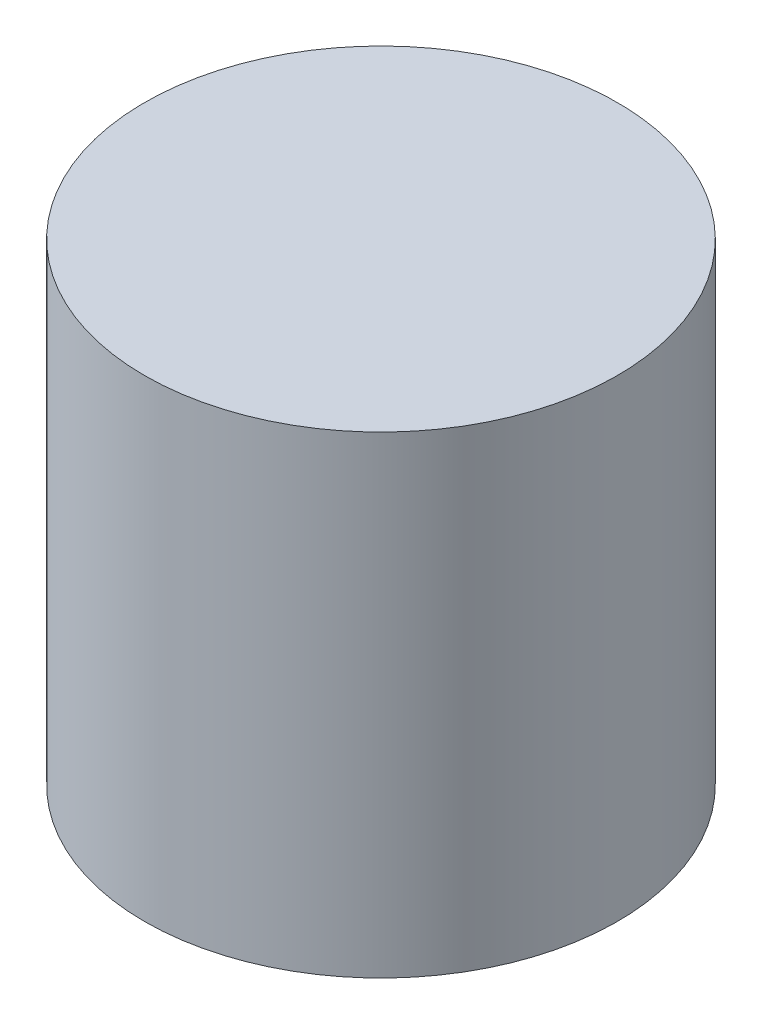
ISO-10303-21;
HEADER;
FILE_DESCRIPTION(('STEP AP214'),'2;1');
FILE_NAME('part.step','',(''),(''),'','','');
FILE_SCHEMA(('AUTOMOTIVE_DESIGN { 1 0 10303 214 1 1 1 1 }'));
ENDSEC;
DATA;
#1=APPLICATION_CONTEXT('core data for automotive mechanical design processes');
#2=APPLICATION_PROTOCOL_DEFINITION('international standard','automotive_design',2000,#1);
#3=PRODUCT_CONTEXT('',#1,'mechanical');
#4=PRODUCT('Part','Part','',(#3));
#5=PRODUCT_RELATED_PRODUCT_CATEGORY('part','',(#4));
#6=PRODUCT_DEFINITION_FORMATION('','',#4);
#7=PRODUCT_DEFINITION_CONTEXT('part definition',#1,'design');
#8=PRODUCT_DEFINITION('design','',#6,#7);
#9=PRODUCT_DEFINITION_SHAPE('','',#8);
#10=(LENGTH_UNIT() NAMED_UNIT(*) SI_UNIT(.MILLI.,.METRE.));
#11=(NAMED_UNIT(*) PLANE_ANGLE_UNIT() SI_UNIT($,.RADIAN.));
#12=(NAMED_UNIT(*) SI_UNIT($,.STERADIAN.) SOLID_ANGLE_UNIT());
#13=UNCERTAINTY_MEASURE_WITH_UNIT(LENGTH_MEASURE(1.E-05),#10,'distance_accuracy_value','');
#14=(GEOMETRIC_REPRESENTATION_CONTEXT(3) GLOBAL_UNCERTAINTY_ASSIGNED_CONTEXT((#13)) GLOBAL_UNIT_ASSIGNED_CONTEXT((#10,
#11,#12)) REPRESENTATION_CONTEXT('',''));
#15=CARTESIAN_POINT('',(0.,0.,0.));
#16=DIRECTION('',(0.,0.,1.));
#17=DIRECTION('',(1.,0.,0.));
#18=AXIS2_PLACEMENT_3D('',#15,#16,#17);
#19=CARTESIAN_POINT('',(0.,185.,0.));
#20=DIRECTION('',(0.,-1.,0.));
#21=DIRECTION('',(0.,0.,-1.));
#22=AXIS2_PLACEMENT_3D('',#19,#20,#21);
#23=CYLINDRICAL_SURFACE('',#22,92.5);
#24=CARTESIAN_POINT('',(0.,185.,0.));
#25=DIRECTION('',(0.,1.,0.));
#26=DIRECTION('',(0.,0.,1.));
#27=AXIS2_PLACEMENT_3D('',#24,#25,#26);
#28=CIRCLE('',#27,92.5);
#29=CARTESIAN_POINT('',(0.,185.,92.5));
#30=VERTEX_POINT('',#29);
#31=EDGE_CURVE('E10',#30,#30,#28,.T.);
#32=ORIENTED_EDGE('',*,*,#31,.F.);
#33=EDGE_LOOP('',(#32));
#34=FACE_BOUND('',#33,.T.);
#35=CARTESIAN_POINT('',(0.,0.,0.));
#36=DIRECTION('',(0.,1.,0.));
#37=DIRECTION('',(0.,0.,1.));
#38=AXIS2_PLACEMENT_3D('',#35,#36,#37);
#39=CIRCLE('',#38,92.5);
#40=CARTESIAN_POINT('',(0.,0.,92.5));
#41=VERTEX_POINT('',#40);
#42=EDGE_CURVE('E37',#41,#41,#39,.T.);
#43=ORIENTED_EDGE('',*,*,#42,.T.);
#44=EDGE_LOOP('',(#43));
#45=FACE_BOUND('',#44,.T.);
#46=ADVANCED_FACE('F34',(#34,#45),#23,.T.);
#47=CARTESIAN_POINT('',(0.,185.,0.));
#48=DIRECTION('',(0.,1.,0.));
#49=DIRECTION('',(0.,0.,1.));
#50=AXIS2_PLACEMENT_3D('',#47,#48,#49);
#51=PLANE('',#50);
#52=ORIENTED_EDGE('',*,*,#31,.T.);
#53=EDGE_LOOP('',(#52));
#54=FACE_BOUND('',#53,.T.);
#55=ADVANCED_FACE('F63',(#54),#51,.T.);
#56=CARTESIAN_POINT('',(0.,0.,0.));
#57=DIRECTION('',(0.,1.,0.));
#58=DIRECTION('',(0.,0.,1.));
#59=AXIS2_PLACEMENT_3D('',#56,#57,#58);
#60=PLANE('',#59);
#61=CARTESIAN_POINT('',(0.,0.,0.));
#62=DIRECTION('',(0.,-1.,0.));
#63=DIRECTION('',(0.,0.,-1.));
#64=AXIS2_PLACEMENT_3D('',#61,#62,#63);
#65=CIRCLE('',#64,50.);
#66=CARTESIAN_POINT('',(0.,0.,-50.));
#67=VERTEX_POINT('',#66);
#68=EDGE_CURVE('E46',#67,#67,#65,.T.);
#69=ORIENTED_EDGE('',*,*,#68,.F.);
#70=EDGE_LOOP('',(#69));
#71=FACE_BOUND('',#70,.T.);
#72=ORIENTED_EDGE('',*,*,#42,.F.);
#73=EDGE_LOOP('',(#72));
#74=FACE_BOUND('',#73,.T.);
#75=ADVANCED_FACE('F57',(#71,#74),#60,.F.);
#76=CARTESIAN_POINT('',(0.,50.,0.));
#77=DIRECTION('',(0.,-1.,0.));
#78=DIRECTION('',(0.,0.,-1.));
#79=AXIS2_PLACEMENT_3D('',#76,#77,#78);
#80=CYLINDRICAL_SURFACE('',#79,50.);
#81=CARTESIAN_POINT('',(0.,50.,0.));
#82=DIRECTION('',(0.,-1.,0.));
#83=DIRECTION('',(0.,0.,-1.));
#84=AXIS2_PLACEMENT_3D('',#81,#82,#83);
#85=CIRCLE('',#84,50.);
#86=CARTESIAN_POINT('',(0.,50.,-50.));
#87=VERTEX_POINT('',#86);
#88=EDGE_CURVE('E44',#87,#87,#85,.T.);
#89=ORIENTED_EDGE('',*,*,#88,.F.);
#90=EDGE_LOOP('',(#89));
#91=FACE_BOUND('',#90,.T.);
#92=ORIENTED_EDGE('',*,*,#68,.T.);
#93=EDGE_LOOP('',(#92));
#94=FACE_BOUND('',#93,.T.);
#95=ADVANCED_FACE('F54',(#91,#94),#80,.F.);
#96=CARTESIAN_POINT('',(0.,50.,0.));
#97=DIRECTION('',(0.,-1.,0.));
#98=DIRECTION('',(0.,0.,-1.));
#99=AXIS2_PLACEMENT_3D('',#96,#97,#98);
#100=PLANE('',#99);
#101=ORIENTED_EDGE('',*,*,#88,.T.);
#102=EDGE_LOOP('',(#101));
#103=FACE_BOUND('',#102,.T.);
#104=ADVANCED_FACE('F52',(#103),#100,.T.);
#105=CLOSED_SHELL('',(#46,#55,#75,#95,#104));
#106=MANIFOLD_SOLID_BREP('B2',#105);
#107=ADVANCED_BREP_SHAPE_REPRESENTATION('',(#18,#106),#14);
#108=SHAPE_DEFINITION_REPRESENTATION(#9,#107);
ENDSEC;
END-ISO-10303-21;
